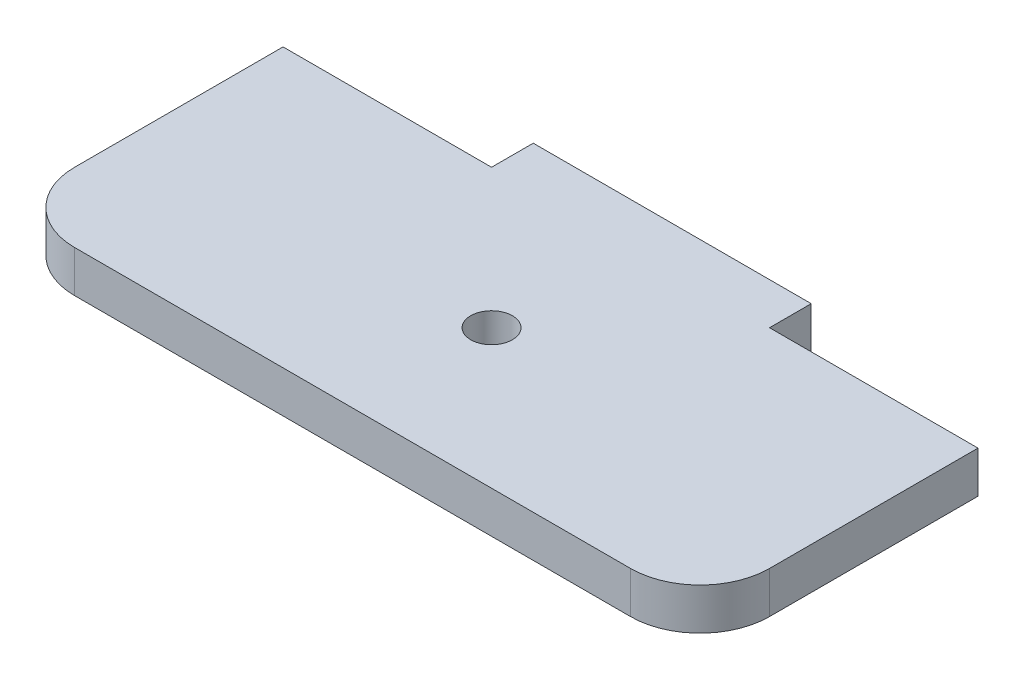
ISO-10303-21;
HEADER;
FILE_DESCRIPTION(('STEP AP214'),'2;1');
FILE_NAME('part.step','',(''),(''),'','','');
FILE_SCHEMA(('AUTOMOTIVE_DESIGN { 1 0 10303 214 1 1 1 1 }'));
ENDSEC;
DATA;
#1=APPLICATION_CONTEXT('core data for automotive mechanical design processes');
#2=APPLICATION_PROTOCOL_DEFINITION('international standard','automotive_design',2000,#1);
#3=PRODUCT_CONTEXT('',#1,'mechanical');
#4=PRODUCT('Part','Part','',(#3));
#5=PRODUCT_RELATED_PRODUCT_CATEGORY('part','',(#4));
#6=PRODUCT_DEFINITION_FORMATION('','',#4);
#7=PRODUCT_DEFINITION_CONTEXT('part definition',#1,'design');
#8=PRODUCT_DEFINITION('design','',#6,#7);
#9=PRODUCT_DEFINITION_SHAPE('','',#8);
#10=(LENGTH_UNIT() NAMED_UNIT(*) SI_UNIT(.MILLI.,.METRE.));
#11=(NAMED_UNIT(*) PLANE_ANGLE_UNIT() SI_UNIT($,.RADIAN.));
#12=(NAMED_UNIT(*) SI_UNIT($,.STERADIAN.) SOLID_ANGLE_UNIT());
#13=UNCERTAINTY_MEASURE_WITH_UNIT(LENGTH_MEASURE(1.E-05),#10,'distance_accuracy_value','');
#14=(GEOMETRIC_REPRESENTATION_CONTEXT(3) GLOBAL_UNCERTAINTY_ASSIGNED_CONTEXT((#13)) GLOBAL_UNIT_ASSIGNED_CONTEXT((#10,
#11,#12)) REPRESENTATION_CONTEXT('',''));
#15=CARTESIAN_POINT('',(0.,0.,0.));
#16=DIRECTION('',(0.,0.,1.));
#17=DIRECTION('',(1.,0.,0.));
#18=AXIS2_PLACEMENT_3D('',#15,#16,#17);
#19=CARTESIAN_POINT('',(25.,3.,-10.));
#20=DIRECTION('',(0.,0.,1.));
#21=DIRECTION('',(1.,0.,0.));
#22=AXIS2_PLACEMENT_3D('',#19,#20,#21);
#23=PLANE('',#22);
#24=DIRECTION('',(0.,-1.,0.));
#25=VECTOR('',#24,1.);
#26=CARTESIAN_POINT('',(10.,0.,-10.));
#27=LINE('',#26,#25);
#28=CARTESIAN_POINT('',(10.,3.,-10.));
#29=VERTEX_POINT('',#28);
#30=CARTESIAN_POINT('',(10.,0.,-10.));
#31=VERTEX_POINT('',#30);
#32=EDGE_CURVE('E54',#29,#31,#27,.T.);
#33=ORIENTED_EDGE('',*,*,#32,.F.);
#34=DIRECTION('',(-1.,0.,0.));
#35=VECTOR('',#34,1.);
#36=CARTESIAN_POINT('',(25.,3.,-10.));
#37=LINE('',#36,#35);
#38=CARTESIAN_POINT('',(25.,3.,-10.));
#39=VERTEX_POINT('',#38);
#40=EDGE_CURVE('E166',#39,#29,#37,.T.);
#41=ORIENTED_EDGE('',*,*,#40,.F.);
#42=DIRECTION('',(0.,-1.,0.));
#43=VECTOR('',#42,1.);
#44=CARTESIAN_POINT('',(25.,3.,-10.));
#45=LINE('',#44,#43);
#46=CARTESIAN_POINT('',(25.,0.,-10.));
#47=VERTEX_POINT('',#46);
#48=EDGE_CURVE('E183',#39,#47,#45,.T.);
#49=ORIENTED_EDGE('',*,*,#48,.T.);
#50=DIRECTION('',(-1.,0.,0.));
#51=VECTOR('',#50,1.);
#52=CARTESIAN_POINT('',(25.,0.,-10.));
#53=LINE('',#52,#51);
#54=EDGE_CURVE('E157',#47,#31,#53,.T.);
#55=ORIENTED_EDGE('',*,*,#54,.T.);
#56=EDGE_LOOP('',(#33,#41,#49,#55));
#57=FACE_BOUND('',#56,.T.);
#58=ADVANCED_FACE('F39',(#57),#23,.F.);
#59=DIRECTION('',(0.,1.,0.));
#60=VECTOR('',#59,1.);
#61=CARTESIAN_POINT('',(-10.,0.,-10.));
#62=LINE('',#61,#60);
#63=CARTESIAN_POINT('',(-10.,0.,-10.));
#64=VERTEX_POINT('',#63);
#65=CARTESIAN_POINT('',(-10.,3.,-10.));
#66=VERTEX_POINT('',#65);
#67=EDGE_CURVE('E62',#64,#66,#62,.T.);
#68=ORIENTED_EDGE('',*,*,#67,.F.);
#69=CARTESIAN_POINT('',(-25.,0.,-10.));
#70=VERTEX_POINT('',#69);
#71=EDGE_CURVE('E179',#64,#70,#53,.T.);
#72=ORIENTED_EDGE('',*,*,#71,.T.);
#73=DIRECTION('',(0.,-1.,0.));
#74=VECTOR('',#73,1.);
#75=CARTESIAN_POINT('',(-25.,3.,-10.));
#76=LINE('',#75,#74);
#77=CARTESIAN_POINT('',(-25.,3.,-10.));
#78=VERTEX_POINT('',#77);
#79=EDGE_CURVE('E168',#78,#70,#76,.T.);
#80=ORIENTED_EDGE('',*,*,#79,.F.);
#81=EDGE_CURVE('E165',#66,#78,#37,.T.);
#82=ORIENTED_EDGE('',*,*,#81,.F.);
#83=EDGE_LOOP('',(#68,#72,#80,#82));
#84=FACE_BOUND('',#83,.T.);
#85=ADVANCED_FACE('F227',(#84),#23,.F.);
#86=CARTESIAN_POINT('',(20.,3.,5.));
#87=DIRECTION('',(0.,1.,0.));
#88=DIRECTION('',(0.,0.,1.));
#89=AXIS2_PLACEMENT_3D('',#86,#87,#88);
#90=PLANE('',#89);
#91=DIRECTION('',(0.,0.,1.));
#92=VECTOR('',#91,1.);
#93=CARTESIAN_POINT('',(-25.,3.,4.99999999999997));
#94=LINE('',#93,#92);
#95=CARTESIAN_POINT('',(-25.,3.,4.99999999999997));
#96=VERTEX_POINT('',#95);
#97=EDGE_CURVE('E153',#78,#96,#94,.T.);
#98=ORIENTED_EDGE('',*,*,#97,.T.);
#99=CARTESIAN_POINT('',(-20.,3.,5.));
#100=DIRECTION('',(0.,1.,0.));
#101=DIRECTION('',(0.,0.,-1.));
#102=AXIS2_PLACEMENT_3D('',#99,#100,#101);
#103=CIRCLE('',#102,5.);
#104=CARTESIAN_POINT('',(-20.,3.,10.));
#105=VERTEX_POINT('',#104);
#106=EDGE_CURVE('E156',#96,#105,#103,.T.);
#107=ORIENTED_EDGE('',*,*,#106,.T.);
#108=DIRECTION('',(1.,0.,0.));
#109=VECTOR('',#108,1.);
#110=CARTESIAN_POINT('',(20.,3.,10.));
#111=LINE('',#110,#109);
#112=CARTESIAN_POINT('',(20.,3.,10.));
#113=VERTEX_POINT('',#112);
#114=EDGE_CURVE('E159',#105,#113,#111,.T.);
#115=ORIENTED_EDGE('',*,*,#114,.T.);
#116=CARTESIAN_POINT('',(20.,3.,5.));
#117=DIRECTION('',(0.,1.,0.));
#118=DIRECTION('',(0.,0.,1.));
#119=AXIS2_PLACEMENT_3D('',#116,#117,#118);
#120=CIRCLE('',#119,5.);
#121=CARTESIAN_POINT('',(25.,3.,4.99999999999996));
#122=VERTEX_POINT('',#121);
#123=EDGE_CURVE('E161',#113,#122,#120,.T.);
#124=ORIENTED_EDGE('',*,*,#123,.T.);
#125=DIRECTION('',(0.,0.,-1.));
#126=VECTOR('',#125,1.);
#127=CARTESIAN_POINT('',(25.,3.,4.99999999999996));
#128=LINE('',#127,#126);
#129=EDGE_CURVE('E163',#122,#39,#128,.T.);
#130=ORIENTED_EDGE('',*,*,#129,.T.);
#131=ORIENTED_EDGE('',*,*,#40,.T.);
#132=DIRECTION('',(0.,0.,1.));
#133=VECTOR('',#132,1.);
#134=CARTESIAN_POINT('',(10.,3.,-13.));
#135=LINE('',#134,#133);
#136=CARTESIAN_POINT('',(10.,3.,-13.));
#137=VERTEX_POINT('',#136);
#138=EDGE_CURVE('E222',#137,#29,#135,.T.);
#139=ORIENTED_EDGE('',*,*,#138,.F.);
#140=DIRECTION('',(1.,0.,0.));
#141=VECTOR('',#140,1.);
#142=CARTESIAN_POINT('',(-10.,3.,-13.));
#143=LINE('',#142,#141);
#144=CARTESIAN_POINT('',(-10.,3.,-13.));
#145=VERTEX_POINT('',#144);
#146=EDGE_CURVE('E135',#145,#137,#143,.T.);
#147=ORIENTED_EDGE('',*,*,#146,.F.);
#148=DIRECTION('',(0.,0.,1.));
#149=VECTOR('',#148,1.);
#150=CARTESIAN_POINT('',(-10.,3.,-13.));
#151=LINE('',#150,#149);
#152=EDGE_CURVE('E146',#145,#66,#151,.T.);
#153=ORIENTED_EDGE('',*,*,#152,.T.);
#154=ORIENTED_EDGE('',*,*,#81,.T.);
#155=EDGE_LOOP('',(#98,#107,#115,#124,#130,#131,#139,#147,#153,#154));
#156=FACE_BOUND('',#155,.T.);
#157=CARTESIAN_POINT('',(0.,3.,0.));
#158=DIRECTION('',(0.,1.,0.));
#159=DIRECTION('',(0.,0.,1.));
#160=AXIS2_PLACEMENT_3D('',#157,#158,#159);
#161=CIRCLE('',#160,1.5);
#162=CARTESIAN_POINT('',(0.,3.,1.5));
#163=VERTEX_POINT('',#162);
#164=EDGE_CURVE('E144',#163,#163,#161,.T.);
#165=ORIENTED_EDGE('',*,*,#164,.F.);
#166=EDGE_LOOP('',(#165));
#167=FACE_BOUND('',#166,.T.);
#168=ADVANCED_FACE('F210',(#156,#167),#90,.T.);
#169=CARTESIAN_POINT('',(20.,0.,5.));
#170=DIRECTION('',(0.,1.,0.));
#171=DIRECTION('',(0.,0.,1.));
#172=AXIS2_PLACEMENT_3D('',#169,#170,#171);
#173=PLANE('',#172);
#174=DIRECTION('',(0.,0.,1.));
#175=VECTOR('',#174,1.);
#176=CARTESIAN_POINT('',(-25.,0.,4.99999999999997));
#177=LINE('',#176,#175);
#178=CARTESIAN_POINT('',(-25.,0.,4.99999999999997));
#179=VERTEX_POINT('',#178);
#180=EDGE_CURVE('E151',#70,#179,#177,.T.);
#181=ORIENTED_EDGE('',*,*,#180,.F.);
#182=ORIENTED_EDGE('',*,*,#71,.F.);
#183=DIRECTION('',(0.,0.,1.));
#184=VECTOR('',#183,1.);
#185=CARTESIAN_POINT('',(-10.,0.,-13.));
#186=LINE('',#185,#184);
#187=CARTESIAN_POINT('',(-10.,0.,-13.));
#188=VERTEX_POINT('',#187);
#189=EDGE_CURVE('E126',#188,#64,#186,.T.);
#190=ORIENTED_EDGE('',*,*,#189,.F.);
#191=DIRECTION('',(-1.,0.,0.));
#192=VECTOR('',#191,1.);
#193=CARTESIAN_POINT('',(-10.,0.,-13.));
#194=LINE('',#193,#192);
#195=CARTESIAN_POINT('',(10.,0.,-13.));
#196=VERTEX_POINT('',#195);
#197=EDGE_CURVE('E117',#196,#188,#194,.T.);
#198=ORIENTED_EDGE('',*,*,#197,.F.);
#199=DIRECTION('',(0.,0.,1.));
#200=VECTOR('',#199,1.);
#201=CARTESIAN_POINT('',(10.,0.,-13.));
#202=LINE('',#201,#200);
#203=EDGE_CURVE('E124',#196,#31,#202,.T.);
#204=ORIENTED_EDGE('',*,*,#203,.T.);
#205=ORIENTED_EDGE('',*,*,#54,.F.);
#206=DIRECTION('',(0.,0.,-1.));
#207=VECTOR('',#206,1.);
#208=CARTESIAN_POINT('',(25.,0.,4.99999999999996));
#209=LINE('',#208,#207);
#210=CARTESIAN_POINT('',(25.,0.,4.99999999999996));
#211=VERTEX_POINT('',#210);
#212=EDGE_CURVE('E177',#211,#47,#209,.T.);
#213=ORIENTED_EDGE('',*,*,#212,.F.);
#214=CARTESIAN_POINT('',(20.,0.,5.));
#215=DIRECTION('',(0.,1.,0.));
#216=DIRECTION('',(0.,0.,1.));
#217=AXIS2_PLACEMENT_3D('',#214,#215,#216);
#218=CIRCLE('',#217,5.);
#219=CARTESIAN_POINT('',(20.,0.,10.));
#220=VERTEX_POINT('',#219);
#221=EDGE_CURVE('E175',#220,#211,#218,.T.);
#222=ORIENTED_EDGE('',*,*,#221,.F.);
#223=DIRECTION('',(1.,0.,0.));
#224=VECTOR('',#223,1.);
#225=CARTESIAN_POINT('',(20.,0.,10.));
#226=LINE('',#225,#224);
#227=CARTESIAN_POINT('',(-20.,0.,10.));
#228=VERTEX_POINT('',#227);
#229=EDGE_CURVE('E173',#228,#220,#226,.T.);
#230=ORIENTED_EDGE('',*,*,#229,.F.);
#231=CARTESIAN_POINT('',(-20.,0.,5.));
#232=DIRECTION('',(0.,1.,0.));
#233=DIRECTION('',(0.,0.,-1.));
#234=AXIS2_PLACEMENT_3D('',#231,#232,#233);
#235=CIRCLE('',#234,5.);
#236=EDGE_CURVE('E171',#179,#228,#235,.T.);
#237=ORIENTED_EDGE('',*,*,#236,.F.);
#238=EDGE_LOOP('',(#181,#182,#190,#198,#204,#205,#213,#222,#230,#237));
#239=FACE_BOUND('',#238,.T.);
#240=CARTESIAN_POINT('',(0.,0.,0.));
#241=DIRECTION('',(0.,1.,0.));
#242=DIRECTION('',(0.,0.,1.));
#243=AXIS2_PLACEMENT_3D('',#240,#241,#242);
#244=CIRCLE('',#243,1.5);
#245=CARTESIAN_POINT('',(0.,0.,1.5));
#246=VERTEX_POINT('',#245);
#247=EDGE_CURVE('E141',#246,#246,#244,.T.);
#248=ORIENTED_EDGE('',*,*,#247,.T.);
#249=EDGE_LOOP('',(#248));
#250=FACE_BOUND('',#249,.T.);
#251=ADVANCED_FACE('F120',(#239,#250),#173,.F.);
#252=CARTESIAN_POINT('',(-25.,3.,4.99999999999997));
#253=DIRECTION('',(1.,0.,0.));
#254=DIRECTION('',(0.,0.,-1.));
#255=AXIS2_PLACEMENT_3D('',#252,#253,#254);
#256=PLANE('',#255);
#257=ORIENTED_EDGE('',*,*,#180,.T.);
#258=DIRECTION('',(0.,-1.,0.));
#259=VECTOR('',#258,1.);
#260=CARTESIAN_POINT('',(-25.,3.,4.99999999999997));
#261=LINE('',#260,#259);
#262=EDGE_CURVE('E11',#96,#179,#261,.T.);
#263=ORIENTED_EDGE('',*,*,#262,.F.);
#264=ORIENTED_EDGE('',*,*,#97,.F.);
#265=ORIENTED_EDGE('',*,*,#79,.T.);
#266=EDGE_LOOP('',(#257,#263,#264,#265));
#267=FACE_BOUND('',#266,.T.);
#268=ADVANCED_FACE('F41',(#267),#256,.F.);
#269=CARTESIAN_POINT('',(-20.,3.,5.));
#270=DIRECTION('',(0.,-1.,0.));
#271=DIRECTION('',(0.,0.,-1.));
#272=AXIS2_PLACEMENT_3D('',#269,#270,#271);
#273=CYLINDRICAL_SURFACE('',#272,5.);
#274=ORIENTED_EDGE('',*,*,#236,.T.);
#275=DIRECTION('',(0.,-1.,0.));
#276=VECTOR('',#275,1.);
#277=CARTESIAN_POINT('',(-20.,3.,10.));
#278=LINE('',#277,#276);
#279=EDGE_CURVE('E47',#105,#228,#278,.T.);
#280=ORIENTED_EDGE('',*,*,#279,.F.);
#281=ORIENTED_EDGE('',*,*,#106,.F.);
#282=ORIENTED_EDGE('',*,*,#262,.T.);
#283=EDGE_LOOP('',(#274,#280,#281,#282));
#284=FACE_BOUND('',#283,.T.);
#285=ADVANCED_FACE('F214',(#284),#273,.T.);
#286=CARTESIAN_POINT('',(20.,3.,10.));
#287=DIRECTION('',(0.,0.,-1.));
#288=DIRECTION('',(-1.,0.,0.));
#289=AXIS2_PLACEMENT_3D('',#286,#287,#288);
#290=PLANE('',#289);
#291=ORIENTED_EDGE('',*,*,#229,.T.);
#292=DIRECTION('',(0.,-1.,0.));
#293=VECTOR('',#292,1.);
#294=CARTESIAN_POINT('',(20.,3.,10.));
#295=LINE('',#294,#293);
#296=EDGE_CURVE('E189',#113,#220,#295,.T.);
#297=ORIENTED_EDGE('',*,*,#296,.F.);
#298=ORIENTED_EDGE('',*,*,#114,.F.);
#299=ORIENTED_EDGE('',*,*,#279,.T.);
#300=EDGE_LOOP('',(#291,#297,#298,#299));
#301=FACE_BOUND('',#300,.T.);
#302=ADVANCED_FACE('F196',(#301),#290,.F.);
#303=CARTESIAN_POINT('',(20.,3.,5.));
#304=DIRECTION('',(0.,-1.,0.));
#305=DIRECTION('',(0.,0.,-1.));
#306=AXIS2_PLACEMENT_3D('',#303,#304,#305);
#307=CYLINDRICAL_SURFACE('',#306,5.);
#308=ORIENTED_EDGE('',*,*,#221,.T.);
#309=DIRECTION('',(0.,-1.,0.));
#310=VECTOR('',#309,1.);
#311=CARTESIAN_POINT('',(25.,3.,4.99999999999996));
#312=LINE('',#311,#310);
#313=EDGE_CURVE('E186',#122,#211,#312,.T.);
#314=ORIENTED_EDGE('',*,*,#313,.F.);
#315=ORIENTED_EDGE('',*,*,#123,.F.);
#316=ORIENTED_EDGE('',*,*,#296,.T.);
#317=EDGE_LOOP('',(#308,#314,#315,#316));
#318=FACE_BOUND('',#317,.T.);
#319=ADVANCED_FACE('F203',(#318),#307,.T.);
#320=CARTESIAN_POINT('',(25.,3.,4.99999999999996));
#321=DIRECTION('',(-1.,0.,0.));
#322=DIRECTION('',(0.,0.,1.));
#323=AXIS2_PLACEMENT_3D('',#320,#321,#322);
#324=PLANE('',#323);
#325=ORIENTED_EDGE('',*,*,#212,.T.);
#326=ORIENTED_EDGE('',*,*,#48,.F.);
#327=ORIENTED_EDGE('',*,*,#129,.F.);
#328=ORIENTED_EDGE('',*,*,#313,.T.);
#329=EDGE_LOOP('',(#325,#326,#327,#328));
#330=FACE_BOUND('',#329,.T.);
#331=ADVANCED_FACE('F207',(#330),#324,.F.);
#332=CARTESIAN_POINT('',(0.,3.,0.));
#333=DIRECTION('',(0.,-1.,0.));
#334=DIRECTION('',(0.,0.,-1.));
#335=AXIS2_PLACEMENT_3D('',#332,#333,#334);
#336=CYLINDRICAL_SURFACE('',#335,1.5);
#337=ORIENTED_EDGE('',*,*,#164,.T.);
#338=EDGE_LOOP('',(#337));
#339=FACE_BOUND('',#338,.T.);
#340=ORIENTED_EDGE('',*,*,#247,.F.);
#341=EDGE_LOOP('',(#340));
#342=FACE_BOUND('',#341,.T.);
#343=ADVANCED_FACE('F239',(#339,#342),#336,.F.);
#344=CARTESIAN_POINT('',(10.,0.,-13.));
#345=DIRECTION('',(-1.,0.,0.));
#346=DIRECTION('',(0.,0.,1.));
#347=AXIS2_PLACEMENT_3D('',#344,#345,#346);
#348=PLANE('',#347);
#349=ORIENTED_EDGE('',*,*,#32,.T.);
#350=ORIENTED_EDGE('',*,*,#203,.F.);
#351=DIRECTION('',(0.,-1.,0.));
#352=VECTOR('',#351,1.);
#353=CARTESIAN_POINT('',(10.,0.,-13.));
#354=LINE('',#353,#352);
#355=EDGE_CURVE('E130',#137,#196,#354,.T.);
#356=ORIENTED_EDGE('',*,*,#355,.F.);
#357=ORIENTED_EDGE('',*,*,#138,.T.);
#358=EDGE_LOOP('',(#349,#350,#356,#357));
#359=FACE_BOUND('',#358,.T.);
#360=ADVANCED_FACE('F140',(#359),#348,.F.);
#361=CARTESIAN_POINT('',(-10.,0.,-13.));
#362=DIRECTION('',(1.,0.,0.));
#363=DIRECTION('',(0.,0.,-1.));
#364=AXIS2_PLACEMENT_3D('',#361,#362,#363);
#365=PLANE('',#364);
#366=ORIENTED_EDGE('',*,*,#67,.T.);
#367=ORIENTED_EDGE('',*,*,#152,.F.);
#368=DIRECTION('',(0.,1.,0.));
#369=VECTOR('',#368,1.);
#370=CARTESIAN_POINT('',(-10.,0.,-13.));
#371=LINE('',#370,#369);
#372=EDGE_CURVE('E129',#188,#145,#371,.T.);
#373=ORIENTED_EDGE('',*,*,#372,.F.);
#374=ORIENTED_EDGE('',*,*,#189,.T.);
#375=EDGE_LOOP('',(#366,#367,#373,#374));
#376=FACE_BOUND('',#375,.T.);
#377=ADVANCED_FACE('F218',(#376),#365,.F.);
#378=CARTESIAN_POINT('',(0.,0.,-13.));
#379=DIRECTION('',(0.,0.,-1.));
#380=DIRECTION('',(-1.,0.,0.));
#381=AXIS2_PLACEMENT_3D('',#378,#379,#380);
#382=PLANE('',#381);
#383=ORIENTED_EDGE('',*,*,#355,.T.);
#384=ORIENTED_EDGE('',*,*,#197,.T.);
#385=ORIENTED_EDGE('',*,*,#372,.T.);
#386=ORIENTED_EDGE('',*,*,#146,.T.);
#387=EDGE_LOOP('',(#383,#384,#385,#386));
#388=FACE_BOUND('',#387,.T.);
#389=ADVANCED_FACE('F133',(#388),#382,.T.);
#390=CLOSED_SHELL('',(#58,#85,#168,#251,#268,#285,#302,#319,#331,#343,#360,#377,#389));
#391=MANIFOLD_SOLID_BREP('B2',#390);
#392=ADVANCED_BREP_SHAPE_REPRESENTATION('',(#18,#391),#14);
#393=SHAPE_DEFINITION_REPRESENTATION(#9,#392);
ENDSEC;
END-ISO-10303-21;
